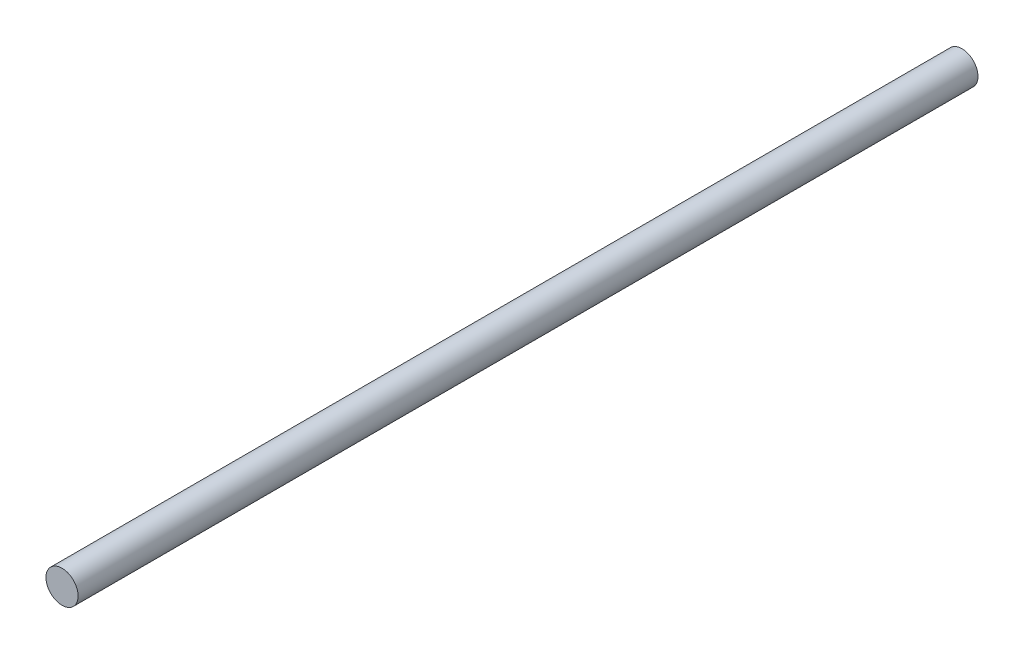
ISO-10303-21;
HEADER;
FILE_DESCRIPTION(('STEP AP214'),'2;1');
FILE_NAME('part.step','',(''),(''),'','','');
FILE_SCHEMA(('AUTOMOTIVE_DESIGN { 1 0 10303 214 1 1 1 1 }'));
ENDSEC;
DATA;
#1=APPLICATION_CONTEXT('core data for automotive mechanical design processes');
#2=APPLICATION_PROTOCOL_DEFINITION('international standard','automotive_design',2000,#1);
#3=PRODUCT_CONTEXT('',#1,'mechanical');
#4=PRODUCT('Part','Part','',(#3));
#5=PRODUCT_RELATED_PRODUCT_CATEGORY('part','',(#4));
#6=PRODUCT_DEFINITION_FORMATION('','',#4);
#7=PRODUCT_DEFINITION_CONTEXT('part definition',#1,'design');
#8=PRODUCT_DEFINITION('design','',#6,#7);
#9=PRODUCT_DEFINITION_SHAPE('','',#8);
#10=(LENGTH_UNIT() NAMED_UNIT(*) SI_UNIT(.MILLI.,.METRE.));
#11=(NAMED_UNIT(*) PLANE_ANGLE_UNIT() SI_UNIT($,.RADIAN.));
#12=(NAMED_UNIT(*) SI_UNIT($,.STERADIAN.) SOLID_ANGLE_UNIT());
#13=UNCERTAINTY_MEASURE_WITH_UNIT(LENGTH_MEASURE(1.E-05),#10,'distance_accuracy_value','');
#14=(GEOMETRIC_REPRESENTATION_CONTEXT(3) GLOBAL_UNCERTAINTY_ASSIGNED_CONTEXT((#13)) GLOBAL_UNIT_ASSIGNED_CONTEXT((#10,
#11,#12)) REPRESENTATION_CONTEXT('',''));
#15=CARTESIAN_POINT('',(0.,0.,0.));
#16=DIRECTION('',(0.,0.,1.));
#17=DIRECTION('',(1.,0.,0.));
#18=AXIS2_PLACEMENT_3D('',#15,#16,#17);
#19=CARTESIAN_POINT('',(0.,0.,700.));
#20=DIRECTION('',(0.,0.,-1.));
#21=DIRECTION('',(-1.,0.,0.));
#22=AXIS2_PLACEMENT_3D('',#19,#20,#21);
#23=CYLINDRICAL_SURFACE('',#22,12.5);
#24=CARTESIAN_POINT('',(0.,0.,700.));
#25=DIRECTION('',(0.,0.,1.));
#26=DIRECTION('',(1.,0.,0.));
#27=AXIS2_PLACEMENT_3D('',#24,#25,#26);
#28=CIRCLE('',#27,12.5);
#29=CARTESIAN_POINT('',(12.5,0.,700.));
#30=VERTEX_POINT('',#29);
#31=EDGE_CURVE('E10',#30,#30,#28,.T.);
#32=ORIENTED_EDGE('',*,*,#31,.F.);
#33=EDGE_LOOP('',(#32));
#34=FACE_BOUND('',#33,.T.);
#35=CARTESIAN_POINT('',(0.,0.,0.));
#36=DIRECTION('',(0.,0.,1.));
#37=DIRECTION('',(1.,0.,0.));
#38=AXIS2_PLACEMENT_3D('',#35,#36,#37);
#39=CIRCLE('',#38,12.5);
#40=CARTESIAN_POINT('',(12.5,0.,0.));
#41=VERTEX_POINT('',#40);
#42=EDGE_CURVE('E37',#41,#41,#39,.T.);
#43=ORIENTED_EDGE('',*,*,#42,.T.);
#44=EDGE_LOOP('',(#43));
#45=FACE_BOUND('',#44,.T.);
#46=ADVANCED_FACE('F40',(#34,#45),#23,.T.);
#47=CARTESIAN_POINT('',(0.,0.,700.));
#48=DIRECTION('',(0.,0.,1.));
#49=DIRECTION('',(1.,0.,0.));
#50=AXIS2_PLACEMENT_3D('',#47,#48,#49);
#51=PLANE('',#50);
#52=ORIENTED_EDGE('',*,*,#31,.T.);
#53=EDGE_LOOP('',(#52));
#54=FACE_BOUND('',#53,.T.);
#55=ADVANCED_FACE('F55',(#54),#51,.T.);
#56=CARTESIAN_POINT('',(0.,0.,0.));
#57=DIRECTION('',(0.,0.,1.));
#58=DIRECTION('',(1.,0.,0.));
#59=AXIS2_PLACEMENT_3D('',#56,#57,#58);
#60=PLANE('',#59);
#61=ORIENTED_EDGE('',*,*,#42,.F.);
#62=EDGE_LOOP('',(#61));
#63=FACE_BOUND('',#62,.T.);
#64=ADVANCED_FACE('F49',(#63),#60,.F.);
#65=CLOSED_SHELL('',(#46,#55,#64));
#66=MANIFOLD_SOLID_BREP('B2',#65);
#67=ADVANCED_BREP_SHAPE_REPRESENTATION('',(#18,#66),#14);
#68=SHAPE_DEFINITION_REPRESENTATION(#9,#67);
ENDSEC;
END-ISO-10303-21;
